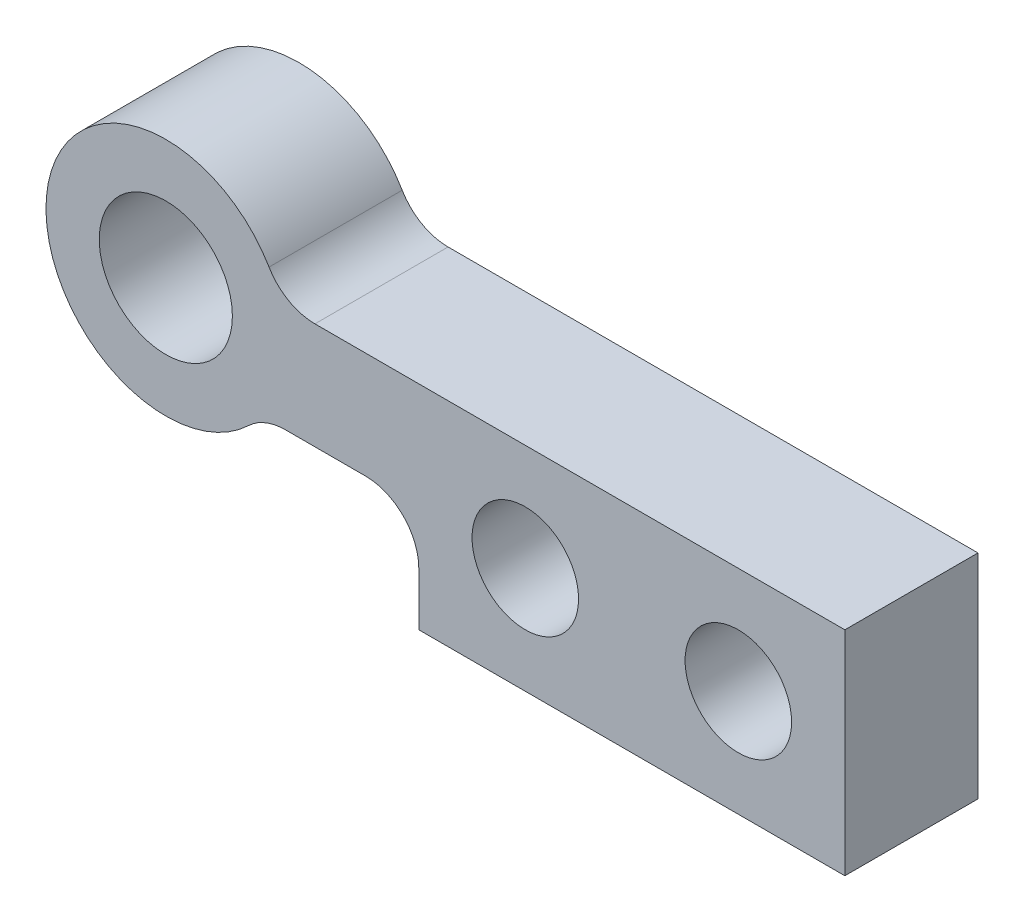
ISO-10303-21;
HEADER;
FILE_DESCRIPTION(('STEP AP214'),'2;1');
FILE_NAME('part.step','',(''),(''),'','','');
FILE_SCHEMA(('AUTOMOTIVE_DESIGN { 1 0 10303 214 1 1 1 1 }'));
ENDSEC;
DATA;
#1=APPLICATION_CONTEXT('core data for automotive mechanical design processes');
#2=APPLICATION_PROTOCOL_DEFINITION('international standard','automotive_design',2000,#1);
#3=PRODUCT_CONTEXT('',#1,'mechanical');
#4=PRODUCT('Part','Part','',(#3));
#5=PRODUCT_RELATED_PRODUCT_CATEGORY('part','',(#4));
#6=PRODUCT_DEFINITION_FORMATION('','',#4);
#7=PRODUCT_DEFINITION_CONTEXT('part definition',#1,'design');
#8=PRODUCT_DEFINITION('design','',#6,#7);
#9=PRODUCT_DEFINITION_SHAPE('','',#8);
#10=(LENGTH_UNIT() NAMED_UNIT(*) SI_UNIT(.MILLI.,.METRE.));
#11=(NAMED_UNIT(*) PLANE_ANGLE_UNIT() SI_UNIT($,.RADIAN.));
#12=(NAMED_UNIT(*) SI_UNIT($,.STERADIAN.) SOLID_ANGLE_UNIT());
#13=UNCERTAINTY_MEASURE_WITH_UNIT(LENGTH_MEASURE(1.E-05),#10,'distance_accuracy_value','');
#14=(GEOMETRIC_REPRESENTATION_CONTEXT(3) GLOBAL_UNCERTAINTY_ASSIGNED_CONTEXT((#13)) GLOBAL_UNIT_ASSIGNED_CONTEXT((#10,
#11,#12)) REPRESENTATION_CONTEXT('',''));
#15=CARTESIAN_POINT('',(0.,0.,0.));
#16=DIRECTION('',(0.,0.,1.));
#17=DIRECTION('',(1.,0.,0.));
#18=AXIS2_PLACEMENT_3D('',#15,#16,#17);
#19=CARTESIAN_POINT('',(0.,4.,5.));
#20=DIRECTION('',(0.,1.,0.));
#21=DIRECTION('',(0.,0.,1.));
#22=AXIS2_PLACEMENT_3D('',#19,#20,#21);
#23=PLANE('',#22);
#24=DIRECTION('',(1.,0.,0.));
#25=VECTOR('',#24,1.);
#26=CARTESIAN_POINT('',(0.,4.,0.));
#27=LINE('',#26,#25);
#28=CARTESIAN_POINT('',(-11.9,4.,0.));
#29=VERTEX_POINT('',#28);
#30=CARTESIAN_POINT('',(8.,4.,0.));
#31=VERTEX_POINT('',#30);
#32=EDGE_CURVE('E156',#29,#31,#27,.T.);
#33=ORIENTED_EDGE('',*,*,#32,.F.);
#34=DIRECTION('',(0.,0.,-1.));
#35=VECTOR('',#34,1.);
#36=CARTESIAN_POINT('',(-11.9,4.,5.));
#37=LINE('',#36,#35);
#38=CARTESIAN_POINT('',(-11.9,4.,5.));
#39=VERTEX_POINT('',#38);
#40=EDGE_CURVE('E200',#29,#39,#37,.F.);
#41=ORIENTED_EDGE('',*,*,#40,.T.);
#42=DIRECTION('',(1.,0.,0.));
#43=VECTOR('',#42,1.);
#44=CARTESIAN_POINT('',(0.,4.,5.));
#45=LINE('',#44,#43);
#46=CARTESIAN_POINT('',(8.,4.,5.));
#47=VERTEX_POINT('',#46);
#48=EDGE_CURVE('E188',#39,#47,#45,.T.);
#49=ORIENTED_EDGE('',*,*,#48,.T.);
#50=DIRECTION('',(0.,0.,-1.));
#51=VECTOR('',#50,1.);
#52=CARTESIAN_POINT('',(8.,4.,5.));
#53=LINE('',#52,#51);
#54=EDGE_CURVE('E155',#47,#31,#53,.T.);
#55=ORIENTED_EDGE('',*,*,#54,.T.);
#56=EDGE_LOOP('',(#33,#41,#49,#55));
#57=FACE_BOUND('',#56,.T.);
#58=ADVANCED_FACE('F41',(#57),#23,.T.);
#59=CARTESIAN_POINT('',(-17.5,2.7,5.));
#60=DIRECTION('',(0.,0.,-1.));
#61=DIRECTION('',(-1.,0.,0.));
#62=AXIS2_PLACEMENT_3D('',#59,#60,#61);
#63=CYLINDRICAL_SURFACE('',#62,4.5);
#64=CARTESIAN_POINT('',(-17.5,2.7,5.));
#65=DIRECTION('',(0.,0.,1.));
#66=DIRECTION('',(1.,0.,0.));
#67=AXIS2_PLACEMENT_3D('',#64,#65,#66);
#68=CIRCLE('',#67,4.5);
#69=CARTESIAN_POINT('',(-13.6230769230769,4.98461538461538,5.));
#70=VERTEX_POINT('',#69);
#71=CARTESIAN_POINT('',(-14.3915461709878,-0.553846153846153,5.));
#72=VERTEX_POINT('',#71);
#73=EDGE_CURVE('E264',#70,#72,#68,.T.);
#74=ORIENTED_EDGE('',*,*,#73,.F.);
#75=DIRECTION('',(0.,0.,-1.));
#76=VECTOR('',#75,1.);
#77=CARTESIAN_POINT('',(-13.6230769230769,4.98461538461538,5.));
#78=LINE('',#77,#76);
#79=CARTESIAN_POINT('',(-13.6230769230769,4.98461538461538,0.));
#80=VERTEX_POINT('',#79);
#81=EDGE_CURVE('E196',#70,#80,#78,.T.);
#82=ORIENTED_EDGE('',*,*,#81,.T.);
#83=CARTESIAN_POINT('',(-17.5,2.7,0.));
#84=DIRECTION('',(0.,0.,1.));
#85=DIRECTION('',(1.,0.,0.));
#86=AXIS2_PLACEMENT_3D('',#83,#84,#85);
#87=CIRCLE('',#86,4.5);
#88=CARTESIAN_POINT('',(-14.3915461709878,-0.553846153846153,0.));
#89=VERTEX_POINT('',#88);
#90=EDGE_CURVE('E159',#80,#89,#87,.T.);
#91=ORIENTED_EDGE('',*,*,#90,.T.);
#92=DIRECTION('',(0.,0.,-1.));
#93=VECTOR('',#92,1.);
#94=CARTESIAN_POINT('',(-14.3915461709878,-0.553846153846153,5.));
#95=LINE('',#94,#93);
#96=EDGE_CURVE('E131',#89,#72,#95,.F.);
#97=ORIENTED_EDGE('',*,*,#96,.T.);
#98=EDGE_LOOP('',(#74,#82,#91,#97));
#99=FACE_BOUND('',#98,.T.);
#100=ADVANCED_FACE('F242',(#99),#63,.T.);
#101=CARTESIAN_POINT('',(0.,0.,5.));
#102=DIRECTION('',(0.,-1.,0.));
#103=DIRECTION('',(1.,0.,0.));
#104=AXIS2_PLACEMENT_3D('',#101,#102,#103);
#105=PLANE('',#104);
#106=DIRECTION('',(-1.,0.,0.));
#107=VECTOR('',#106,1.);
#108=CARTESIAN_POINT('',(0.,0.,5.));
#109=LINE('',#108,#107);
#110=CARTESIAN_POINT('',(-10.,0.,5.));
#111=VERTEX_POINT('',#110);
#112=CARTESIAN_POINT('',(-13.0100111358713,0.,5.));
#113=VERTEX_POINT('',#112);
#114=EDGE_CURVE('E120',#111,#113,#109,.T.);
#115=ORIENTED_EDGE('',*,*,#114,.T.);
#116=DIRECTION('',(0.,0.,-1.));
#117=VECTOR('',#116,1.);
#118=CARTESIAN_POINT('',(-13.0100111358713,0.,5.));
#119=LINE('',#118,#117);
#120=CARTESIAN_POINT('',(-13.0100111358713,0.,0.));
#121=VERTEX_POINT('',#120);
#122=EDGE_CURVE('E206',#113,#121,#119,.T.);
#123=ORIENTED_EDGE('',*,*,#122,.T.);
#124=DIRECTION('',(-1.,0.,0.));
#125=VECTOR('',#124,1.);
#126=CARTESIAN_POINT('',(0.,0.,0.));
#127=LINE('',#126,#125);
#128=CARTESIAN_POINT('',(-10.,0.,0.));
#129=VERTEX_POINT('',#128);
#130=EDGE_CURVE('E163',#129,#121,#127,.T.);
#131=ORIENTED_EDGE('',*,*,#130,.F.);
#132=DIRECTION('',(0.,0.,-1.));
#133=VECTOR('',#132,1.);
#134=CARTESIAN_POINT('',(-10.,0.,5.));
#135=LINE('',#134,#133);
#136=EDGE_CURVE('E203',#129,#111,#135,.F.);
#137=ORIENTED_EDGE('',*,*,#136,.T.);
#138=EDGE_LOOP('',(#115,#123,#131,#137));
#139=FACE_BOUND('',#138,.T.);
#140=ADVANCED_FACE('F232',(#139),#105,.T.);
#141=CARTESIAN_POINT('',(-8.,0.,5.));
#142=DIRECTION('',(1.,0.,0.));
#143=DIRECTION('',(0.,0.,-1.));
#144=AXIS2_PLACEMENT_3D('',#141,#142,#143);
#145=PLANE('',#144);
#146=DIRECTION('',(0.,-1.,0.));
#147=VECTOR('',#146,1.);
#148=CARTESIAN_POINT('',(-8.,0.,5.));
#149=LINE('',#148,#147);
#150=CARTESIAN_POINT('',(-8.,-2.,5.));
#151=VERTEX_POINT('',#150);
#152=CARTESIAN_POINT('',(-8.,-4.,5.));
#153=VERTEX_POINT('',#152);
#154=EDGE_CURVE('E109',#151,#153,#149,.T.);
#155=ORIENTED_EDGE('',*,*,#154,.F.);
#156=DIRECTION('',(0.,0.,-1.));
#157=VECTOR('',#156,1.);
#158=CARTESIAN_POINT('',(-8.,-2.,5.));
#159=LINE('',#158,#157);
#160=CARTESIAN_POINT('',(-8.,-2.,0.));
#161=VERTEX_POINT('',#160);
#162=EDGE_CURVE('E210',#151,#161,#159,.T.);
#163=ORIENTED_EDGE('',*,*,#162,.T.);
#164=DIRECTION('',(0.,-1.,0.));
#165=VECTOR('',#164,1.);
#166=CARTESIAN_POINT('',(-8.,0.,0.));
#167=LINE('',#166,#165);
#168=CARTESIAN_POINT('',(-8.,-4.,0.));
#169=VERTEX_POINT('',#168);
#170=EDGE_CURVE('E126',#161,#169,#167,.T.);
#171=ORIENTED_EDGE('',*,*,#170,.T.);
#172=DIRECTION('',(0.,0.,-1.));
#173=VECTOR('',#172,1.);
#174=CARTESIAN_POINT('',(-8.,-4.,5.));
#175=LINE('',#174,#173);
#176=EDGE_CURVE('E123',#153,#169,#175,.T.);
#177=ORIENTED_EDGE('',*,*,#176,.F.);
#178=EDGE_LOOP('',(#155,#163,#171,#177));
#179=FACE_BOUND('',#178,.T.);
#180=ADVANCED_FACE('F124',(#179),#145,.F.);
#181=CARTESIAN_POINT('',(0.,-4.,5.));
#182=DIRECTION('',(0.,1.,0.));
#183=DIRECTION('',(0.,0.,1.));
#184=AXIS2_PLACEMENT_3D('',#181,#182,#183);
#185=PLANE('',#184);
#186=DIRECTION('',(1.,0.,0.));
#187=VECTOR('',#186,1.);
#188=CARTESIAN_POINT('',(0.,-4.,0.));
#189=LINE('',#188,#187);
#190=CARTESIAN_POINT('',(8.,-4.,0.));
#191=VERTEX_POINT('',#190);
#192=EDGE_CURVE('E169',#169,#191,#189,.T.);
#193=ORIENTED_EDGE('',*,*,#192,.T.);
#194=DIRECTION('',(0.,0.,-1.));
#195=VECTOR('',#194,1.);
#196=CARTESIAN_POINT('',(8.,-4.,5.));
#197=LINE('',#196,#195);
#198=CARTESIAN_POINT('',(8.,-4.,5.));
#199=VERTEX_POINT('',#198);
#200=EDGE_CURVE('E132',#199,#191,#197,.T.);
#201=ORIENTED_EDGE('',*,*,#200,.F.);
#202=DIRECTION('',(1.,0.,0.));
#203=VECTOR('',#202,1.);
#204=CARTESIAN_POINT('',(0.,-4.,5.));
#205=LINE('',#204,#203);
#206=EDGE_CURVE('E116',#153,#199,#205,.T.);
#207=ORIENTED_EDGE('',*,*,#206,.F.);
#208=ORIENTED_EDGE('',*,*,#176,.T.);
#209=EDGE_LOOP('',(#193,#201,#207,#208));
#210=FACE_BOUND('',#209,.T.);
#211=ADVANCED_FACE('F134',(#210),#185,.F.);
#212=CARTESIAN_POINT('',(-4.,0.,5.));
#213=DIRECTION('',(0.,0.,-1.));
#214=DIRECTION('',(-1.,0.,0.));
#215=AXIS2_PLACEMENT_3D('',#212,#213,#214);
#216=CYLINDRICAL_SURFACE('',#215,2.);
#217=CARTESIAN_POINT('',(-4.,0.,5.));
#218=DIRECTION('',(0.,0.,1.));
#219=DIRECTION('',(1.,0.,0.));
#220=AXIS2_PLACEMENT_3D('',#217,#218,#219);
#221=CIRCLE('',#220,2.);
#222=CARTESIAN_POINT('',(-2.,0.,5.));
#223=VERTEX_POINT('',#222);
#224=EDGE_CURVE('E147',#223,#223,#221,.T.);
#225=ORIENTED_EDGE('',*,*,#224,.T.);
#226=EDGE_LOOP('',(#225));
#227=FACE_BOUND('',#226,.T.);
#228=CARTESIAN_POINT('',(-4.,0.,0.));
#229=DIRECTION('',(0.,0.,1.));
#230=DIRECTION('',(1.,0.,0.));
#231=AXIS2_PLACEMENT_3D('',#228,#229,#230);
#232=CIRCLE('',#231,2.);
#233=CARTESIAN_POINT('',(-2.,0.,0.));
#234=VERTEX_POINT('',#233);
#235=EDGE_CURVE('E180',#234,#234,#232,.T.);
#236=ORIENTED_EDGE('',*,*,#235,.F.);
#237=EDGE_LOOP('',(#236));
#238=FACE_BOUND('',#237,.T.);
#239=ADVANCED_FACE('F286',(#227,#238),#216,.F.);
#240=CARTESIAN_POINT('',(4.,0.,5.));
#241=DIRECTION('',(0.,0.,-1.));
#242=DIRECTION('',(-1.,0.,0.));
#243=AXIS2_PLACEMENT_3D('',#240,#241,#242);
#244=CYLINDRICAL_SURFACE('',#243,2.);
#245=CARTESIAN_POINT('',(4.,0.,5.));
#246=DIRECTION('',(0.,0.,1.));
#247=DIRECTION('',(1.,0.,0.));
#248=AXIS2_PLACEMENT_3D('',#245,#246,#247);
#249=CIRCLE('',#248,2.);
#250=CARTESIAN_POINT('',(6.,0.,5.));
#251=VERTEX_POINT('',#250);
#252=EDGE_CURVE('E140',#251,#251,#249,.T.);
#253=ORIENTED_EDGE('',*,*,#252,.T.);
#254=EDGE_LOOP('',(#253));
#255=FACE_BOUND('',#254,.T.);
#256=CARTESIAN_POINT('',(4.,0.,0.));
#257=DIRECTION('',(0.,0.,1.));
#258=DIRECTION('',(1.,0.,0.));
#259=AXIS2_PLACEMENT_3D('',#256,#257,#258);
#260=CIRCLE('',#259,2.);
#261=CARTESIAN_POINT('',(6.,0.,0.));
#262=VERTEX_POINT('',#261);
#263=EDGE_CURVE('E176',#262,#262,#260,.T.);
#264=ORIENTED_EDGE('',*,*,#263,.F.);
#265=EDGE_LOOP('',(#264));
#266=FACE_BOUND('',#265,.T.);
#267=ADVANCED_FACE('F278',(#255,#266),#244,.F.);
#268=CARTESIAN_POINT('',(8.,0.,5.));
#269=DIRECTION('',(1.,0.,0.));
#270=DIRECTION('',(0.,0.,-1.));
#271=AXIS2_PLACEMENT_3D('',#268,#269,#270);
#272=PLANE('',#271);
#273=DIRECTION('',(0.,-1.,0.));
#274=VECTOR('',#273,1.);
#275=CARTESIAN_POINT('',(8.,0.,0.));
#276=LINE('',#275,#274);
#277=EDGE_CURVE('E172',#31,#191,#276,.T.);
#278=ORIENTED_EDGE('',*,*,#277,.F.);
#279=ORIENTED_EDGE('',*,*,#54,.F.);
#280=DIRECTION('',(0.,-1.,0.));
#281=VECTOR('',#280,1.);
#282=CARTESIAN_POINT('',(8.,0.,5.));
#283=LINE('',#282,#281);
#284=EDGE_CURVE('E137',#47,#199,#283,.T.);
#285=ORIENTED_EDGE('',*,*,#284,.T.);
#286=ORIENTED_EDGE('',*,*,#200,.T.);
#287=EDGE_LOOP('',(#278,#279,#285,#286));
#288=FACE_BOUND('',#287,.T.);
#289=ADVANCED_FACE('F275',(#288),#272,.T.);
#290=CARTESIAN_POINT('',(-17.5,2.7,5.));
#291=DIRECTION('',(0.,0.,-1.));
#292=DIRECTION('',(-1.,0.,0.));
#293=AXIS2_PLACEMENT_3D('',#290,#291,#292);
#294=CYLINDRICAL_SURFACE('',#293,2.5);
#295=CARTESIAN_POINT('',(-17.5,2.7,5.));
#296=DIRECTION('',(0.,0.,1.));
#297=DIRECTION('',(1.,0.,0.));
#298=AXIS2_PLACEMENT_3D('',#295,#296,#297);
#299=CIRCLE('',#298,2.5);
#300=CARTESIAN_POINT('',(-15.,2.7,5.));
#301=VERTEX_POINT('',#300);
#302=EDGE_CURVE('E151',#301,#301,#299,.T.);
#303=ORIENTED_EDGE('',*,*,#302,.T.);
#304=EDGE_LOOP('',(#303));
#305=FACE_BOUND('',#304,.T.);
#306=CARTESIAN_POINT('',(-17.5,2.7,0.));
#307=DIRECTION('',(0.,0.,1.));
#308=DIRECTION('',(1.,0.,0.));
#309=AXIS2_PLACEMENT_3D('',#306,#307,#308);
#310=CIRCLE('',#309,2.5);
#311=CARTESIAN_POINT('',(-15.,2.7,0.));
#312=VERTEX_POINT('',#311);
#313=EDGE_CURVE('E184',#312,#312,#310,.T.);
#314=ORIENTED_EDGE('',*,*,#313,.F.);
#315=EDGE_LOOP('',(#314));
#316=FACE_BOUND('',#315,.T.);
#317=ADVANCED_FACE('F277',(#305,#316),#294,.F.);
#318=CARTESIAN_POINT('',(0.,0.,5.));
#319=DIRECTION('',(0.,0.,1.));
#320=DIRECTION('',(1.,0.,0.));
#321=AXIS2_PLACEMENT_3D('',#318,#319,#320);
#322=PLANE('',#321);
#323=ORIENTED_EDGE('',*,*,#48,.F.);
#324=CARTESIAN_POINT('',(-11.9,6.,5.));
#325=DIRECTION('',(0.,0.,1.));
#326=DIRECTION('',(1.,0.,0.));
#327=AXIS2_PLACEMENT_3D('',#324,#325,#326);
#328=CIRCLE('',#327,2.);
#329=EDGE_CURVE('E216',#39,#70,#328,.F.);
#330=ORIENTED_EDGE('',*,*,#329,.T.);
#331=ORIENTED_EDGE('',*,*,#73,.T.);
#332=CARTESIAN_POINT('',(-13.0100111358713,-2.,5.));
#333=DIRECTION('',(0.,0.,1.));
#334=DIRECTION('',(1.,0.,0.));
#335=AXIS2_PLACEMENT_3D('',#332,#333,#334);
#336=CIRCLE('',#335,2.);
#337=EDGE_CURVE('E222',#72,#113,#336,.F.);
#338=ORIENTED_EDGE('',*,*,#337,.T.);
#339=ORIENTED_EDGE('',*,*,#114,.F.);
#340=CARTESIAN_POINT('',(-10.,-2.,5.));
#341=DIRECTION('',(0.,0.,1.));
#342=DIRECTION('',(1.,0.,0.));
#343=AXIS2_PLACEMENT_3D('',#340,#341,#342);
#344=CIRCLE('',#343,2.);
#345=EDGE_CURVE('E11',#111,#151,#344,.F.);
#346=ORIENTED_EDGE('',*,*,#345,.T.);
#347=ORIENTED_EDGE('',*,*,#154,.T.);
#348=ORIENTED_EDGE('',*,*,#206,.T.);
#349=ORIENTED_EDGE('',*,*,#284,.F.);
#350=EDGE_LOOP('',(#323,#330,#331,#338,#339,#346,#347,#348,#349));
#351=FACE_BOUND('',#350,.T.);
#352=ORIENTED_EDGE('',*,*,#252,.F.);
#353=EDGE_LOOP('',(#352));
#354=FACE_BOUND('',#353,.T.);
#355=ORIENTED_EDGE('',*,*,#224,.F.);
#356=EDGE_LOOP('',(#355));
#357=FACE_BOUND('',#356,.T.);
#358=ORIENTED_EDGE('',*,*,#302,.F.);
#359=EDGE_LOOP('',(#358));
#360=FACE_BOUND('',#359,.T.);
#361=ADVANCED_FACE('F112',(#351,#354,#357,#360),#322,.T.);
#362=CARTESIAN_POINT('',(0.,0.,0.));
#363=DIRECTION('',(0.,0.,1.));
#364=DIRECTION('',(1.,0.,0.));
#365=AXIS2_PLACEMENT_3D('',#362,#363,#364);
#366=PLANE('',#365);
#367=ORIENTED_EDGE('',*,*,#90,.F.);
#368=CARTESIAN_POINT('',(-11.9,6.,0.));
#369=DIRECTION('',(0.,0.,1.));
#370=DIRECTION('',(1.,0.,0.));
#371=AXIS2_PLACEMENT_3D('',#368,#369,#370);
#372=CIRCLE('',#371,2.);
#373=EDGE_CURVE('E213',#80,#29,#372,.T.);
#374=ORIENTED_EDGE('',*,*,#373,.T.);
#375=ORIENTED_EDGE('',*,*,#32,.T.);
#376=ORIENTED_EDGE('',*,*,#277,.T.);
#377=ORIENTED_EDGE('',*,*,#192,.F.);
#378=ORIENTED_EDGE('',*,*,#170,.F.);
#379=CARTESIAN_POINT('',(-10.,-2.,0.));
#380=DIRECTION('',(0.,0.,1.));
#381=DIRECTION('',(1.,0.,0.));
#382=AXIS2_PLACEMENT_3D('',#379,#380,#381);
#383=CIRCLE('',#382,2.);
#384=EDGE_CURVE('E50',#161,#129,#383,.T.);
#385=ORIENTED_EDGE('',*,*,#384,.T.);
#386=ORIENTED_EDGE('',*,*,#130,.T.);
#387=CARTESIAN_POINT('',(-13.0100111358713,-2.,0.));
#388=DIRECTION('',(0.,0.,1.));
#389=DIRECTION('',(1.,0.,0.));
#390=AXIS2_PLACEMENT_3D('',#387,#388,#389);
#391=CIRCLE('',#390,2.);
#392=EDGE_CURVE('E219',#121,#89,#391,.T.);
#393=ORIENTED_EDGE('',*,*,#392,.T.);
#394=EDGE_LOOP('',(#367,#374,#375,#376,#377,#378,#385,#386,#393));
#395=FACE_BOUND('',#394,.T.);
#396=ORIENTED_EDGE('',*,*,#263,.T.);
#397=EDGE_LOOP('',(#396));
#398=FACE_BOUND('',#397,.T.);
#399=ORIENTED_EDGE('',*,*,#235,.T.);
#400=EDGE_LOOP('',(#399));
#401=FACE_BOUND('',#400,.T.);
#402=ORIENTED_EDGE('',*,*,#313,.T.);
#403=EDGE_LOOP('',(#402));
#404=FACE_BOUND('',#403,.T.);
#405=ADVANCED_FACE('F228',(#395,#398,#401,#404),#366,.F.);
#406=CARTESIAN_POINT('',(-11.9,6.,5.));
#407=DIRECTION('',(0.,0.,-1.));
#408=DIRECTION('',(-1.,0.,0.));
#409=AXIS2_PLACEMENT_3D('',#406,#407,#408);
#410=CYLINDRICAL_SURFACE('',#409,2.);
#411=ORIENTED_EDGE('',*,*,#329,.F.);
#412=ORIENTED_EDGE('',*,*,#40,.F.);
#413=ORIENTED_EDGE('',*,*,#373,.F.);
#414=ORIENTED_EDGE('',*,*,#81,.F.);
#415=EDGE_LOOP('',(#411,#412,#413,#414));
#416=FACE_BOUND('',#415,.T.);
#417=ADVANCED_FACE('F239',(#416),#410,.F.);
#418=CARTESIAN_POINT('',(-13.0100111358713,-2.,5.));
#419=DIRECTION('',(0.,0.,-1.));
#420=DIRECTION('',(-1.,0.,0.));
#421=AXIS2_PLACEMENT_3D('',#418,#419,#420);
#422=CYLINDRICAL_SURFACE('',#421,2.);
#423=ORIENTED_EDGE('',*,*,#337,.F.);
#424=ORIENTED_EDGE('',*,*,#96,.F.);
#425=ORIENTED_EDGE('',*,*,#392,.F.);
#426=ORIENTED_EDGE('',*,*,#122,.F.);
#427=EDGE_LOOP('',(#423,#424,#425,#426));
#428=FACE_BOUND('',#427,.T.);
#429=ADVANCED_FACE('F235',(#428),#422,.F.);
#430=CARTESIAN_POINT('',(-10.,-2.,5.));
#431=DIRECTION('',(0.,0.,-1.));
#432=DIRECTION('',(-1.,0.,0.));
#433=AXIS2_PLACEMENT_3D('',#430,#431,#432);
#434=CYLINDRICAL_SURFACE('',#433,2.);
#435=ORIENTED_EDGE('',*,*,#345,.F.);
#436=ORIENTED_EDGE('',*,*,#136,.F.);
#437=ORIENTED_EDGE('',*,*,#384,.F.);
#438=ORIENTED_EDGE('',*,*,#162,.F.);
#439=EDGE_LOOP('',(#435,#436,#437,#438));
#440=FACE_BOUND('',#439,.T.);
#441=ADVANCED_FACE('F43',(#440),#434,.F.);
#442=CLOSED_SHELL('',(#58,#100,#140,#180,#211,#239,#267,#289,#317,#361,#405,#417,#429,#441));
#443=MANIFOLD_SOLID_BREP('B2',#442);
#444=ADVANCED_BREP_SHAPE_REPRESENTATION('',(#18,#443),#14);
#445=SHAPE_DEFINITION_REPRESENTATION(#9,#444);
ENDSEC;
END-ISO-10303-21;
